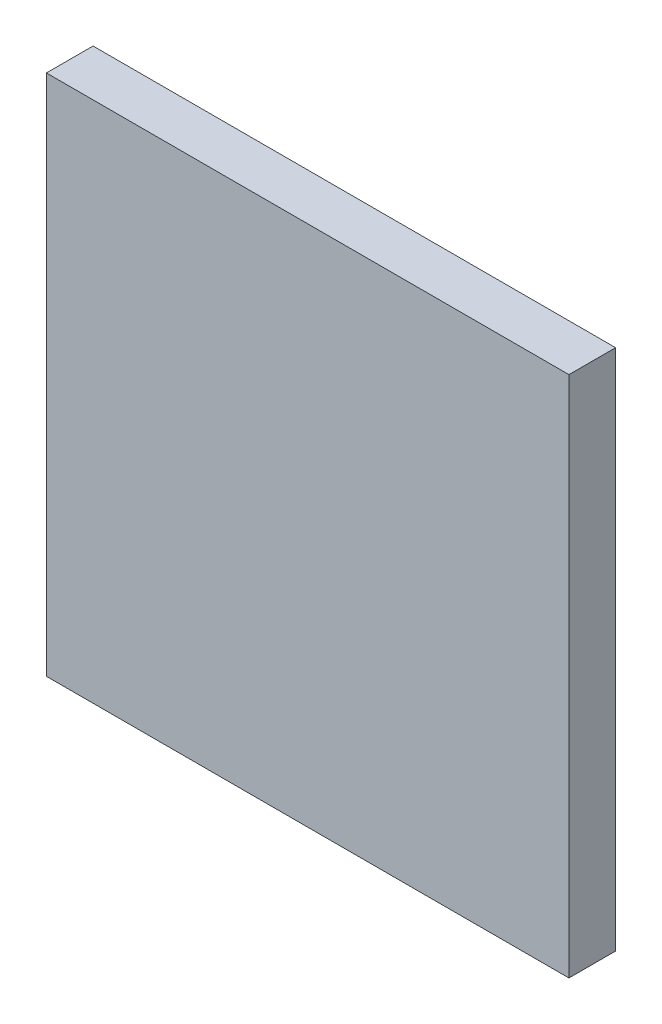
ISO-10303-21;
HEADER;
FILE_DESCRIPTION(('STEP AP214'),'2;1');
FILE_NAME('part.step','',(''),(''),'','','');
FILE_SCHEMA(('AUTOMOTIVE_DESIGN { 1 0 10303 214 1 1 1 1 }'));
ENDSEC;
DATA;
#1=APPLICATION_CONTEXT('core data for automotive mechanical design processes');
#2=APPLICATION_PROTOCOL_DEFINITION('international standard','automotive_design',2000,#1);
#3=PRODUCT_CONTEXT('',#1,'mechanical');
#4=PRODUCT('Part','Part','',(#3));
#5=PRODUCT_RELATED_PRODUCT_CATEGORY('part','',(#4));
#6=PRODUCT_DEFINITION_FORMATION('','',#4);
#7=PRODUCT_DEFINITION_CONTEXT('part definition',#1,'design');
#8=PRODUCT_DEFINITION('design','',#6,#7);
#9=PRODUCT_DEFINITION_SHAPE('','',#8);
#10=(LENGTH_UNIT() NAMED_UNIT(*) SI_UNIT(.MILLI.,.METRE.));
#11=(NAMED_UNIT(*) PLANE_ANGLE_UNIT() SI_UNIT($,.RADIAN.));
#12=(NAMED_UNIT(*) SI_UNIT($,.STERADIAN.) SOLID_ANGLE_UNIT());
#13=UNCERTAINTY_MEASURE_WITH_UNIT(LENGTH_MEASURE(1.E-05),#10,'distance_accuracy_value','');
#14=(GEOMETRIC_REPRESENTATION_CONTEXT(3) GLOBAL_UNCERTAINTY_ASSIGNED_CONTEXT((#13)) GLOBAL_UNIT_ASSIGNED_CONTEXT((#10,
#11,#12)) REPRESENTATION_CONTEXT('',''));
#15=CARTESIAN_POINT('',(0.,0.,0.));
#16=DIRECTION('',(0.,0.,1.));
#17=DIRECTION('',(1.,0.,0.));
#18=AXIS2_PLACEMENT_3D('',#15,#16,#17);
#19=CARTESIAN_POINT('',(28.,28.,2.));
#20=DIRECTION('',(0.,-1.,0.));
#21=DIRECTION('',(0.,0.,-1.));
#22=AXIS2_PLACEMENT_3D('',#19,#20,#21);
#23=PLANE('',#22);
#24=DIRECTION('',(0.,0.,-1.));
#25=VECTOR('',#24,1.);
#26=CARTESIAN_POINT('',(28.,28.,2.));
#27=LINE('',#26,#25);
#28=CARTESIAN_POINT('',(28.,28.,2.));
#29=VERTEX_POINT('',#28);
#30=CARTESIAN_POINT('',(28.,28.,-3.));
#31=VERTEX_POINT('',#30);
#32=EDGE_CURVE('E154',#29,#31,#27,.T.);
#33=ORIENTED_EDGE('',*,*,#32,.T.);
#34=DIRECTION('',(-1.,0.,0.));
#35=VECTOR('',#34,1.);
#36=CARTESIAN_POINT('',(0.,28.,-3.));
#37=LINE('',#36,#35);
#38=CARTESIAN_POINT('',(-28.,28.,-3.));
#39=VERTEX_POINT('',#38);
#40=EDGE_CURVE('E128',#31,#39,#37,.T.);
#41=ORIENTED_EDGE('',*,*,#40,.T.);
#42=DIRECTION('',(0.,0.,-1.));
#43=VECTOR('',#42,1.);
#44=CARTESIAN_POINT('',(-28.,28.,2.));
#45=LINE('',#44,#43);
#46=CARTESIAN_POINT('',(-28.,28.,2.));
#47=VERTEX_POINT('',#46);
#48=EDGE_CURVE('E11',#47,#39,#45,.T.);
#49=ORIENTED_EDGE('',*,*,#48,.F.);
#50=DIRECTION('',(-1.,0.,0.));
#51=VECTOR('',#50,1.);
#52=CARTESIAN_POINT('',(28.,28.,2.));
#53=LINE('',#52,#51);
#54=EDGE_CURVE('E141',#29,#47,#53,.T.);
#55=ORIENTED_EDGE('',*,*,#54,.F.);
#56=EDGE_LOOP('',(#33,#41,#49,#55));
#57=FACE_BOUND('',#56,.T.);
#58=ADVANCED_FACE('F33',(#57),#23,.F.);
#59=CARTESIAN_POINT('',(-28.,28.,2.));
#60=DIRECTION('',(1.,0.,0.));
#61=DIRECTION('',(0.,1.,0.));
#62=AXIS2_PLACEMENT_3D('',#59,#60,#61);
#63=PLANE('',#62);
#64=ORIENTED_EDGE('',*,*,#48,.T.);
#65=DIRECTION('',(0.,-1.,0.));
#66=VECTOR('',#65,1.);
#67=CARTESIAN_POINT('',(-28.,0.,-3.));
#68=LINE('',#67,#66);
#69=CARTESIAN_POINT('',(-28.,-28.,-3.));
#70=VERTEX_POINT('',#69);
#71=EDGE_CURVE('E131',#39,#70,#68,.T.);
#72=ORIENTED_EDGE('',*,*,#71,.T.);
#73=DIRECTION('',(0.,0.,-1.));
#74=VECTOR('',#73,1.);
#75=CARTESIAN_POINT('',(-28.,-28.,2.));
#76=LINE('',#75,#74);
#77=CARTESIAN_POINT('',(-28.,-28.,2.));
#78=VERTEX_POINT('',#77);
#79=EDGE_CURVE('E40',#78,#70,#76,.T.);
#80=ORIENTED_EDGE('',*,*,#79,.F.);
#81=DIRECTION('',(0.,-1.,0.));
#82=VECTOR('',#81,1.);
#83=CARTESIAN_POINT('',(-28.,28.,2.));
#84=LINE('',#83,#82);
#85=EDGE_CURVE('E148',#47,#78,#84,.T.);
#86=ORIENTED_EDGE('',*,*,#85,.F.);
#87=EDGE_LOOP('',(#64,#72,#80,#86));
#88=FACE_BOUND('',#87,.T.);
#89=ADVANCED_FACE('F165',(#88),#63,.F.);
#90=CARTESIAN_POINT('',(-28.,-28.,2.));
#91=DIRECTION('',(0.,1.,0.));
#92=DIRECTION('',(0.,0.,1.));
#93=AXIS2_PLACEMENT_3D('',#90,#91,#92);
#94=PLANE('',#93);
#95=ORIENTED_EDGE('',*,*,#79,.T.);
#96=DIRECTION('',(1.,0.,0.));
#97=VECTOR('',#96,1.);
#98=CARTESIAN_POINT('',(0.,-28.,-3.));
#99=LINE('',#98,#97);
#100=CARTESIAN_POINT('',(28.,-28.,-3.));
#101=VERTEX_POINT('',#100);
#102=EDGE_CURVE('E115',#70,#101,#99,.T.);
#103=ORIENTED_EDGE('',*,*,#102,.T.);
#104=DIRECTION('',(0.,0.,-1.));
#105=VECTOR('',#104,1.);
#106=CARTESIAN_POINT('',(28.,-28.,2.));
#107=LINE('',#106,#105);
#108=CARTESIAN_POINT('',(28.,-28.,2.));
#109=VERTEX_POINT('',#108);
#110=EDGE_CURVE('E156',#109,#101,#107,.T.);
#111=ORIENTED_EDGE('',*,*,#110,.F.);
#112=DIRECTION('',(1.,0.,0.));
#113=VECTOR('',#112,1.);
#114=CARTESIAN_POINT('',(-28.,-28.,2.));
#115=LINE('',#114,#113);
#116=EDGE_CURVE('E150',#78,#109,#115,.T.);
#117=ORIENTED_EDGE('',*,*,#116,.F.);
#118=EDGE_LOOP('',(#95,#103,#111,#117));
#119=FACE_BOUND('',#118,.T.);
#120=ADVANCED_FACE('F160',(#119),#94,.F.);
#121=CARTESIAN_POINT('',(28.,-28.,2.));
#122=DIRECTION('',(-1.,0.,0.));
#123=DIRECTION('',(0.,-1.,0.));
#124=AXIS2_PLACEMENT_3D('',#121,#122,#123);
#125=PLANE('',#124);
#126=ORIENTED_EDGE('',*,*,#110,.T.);
#127=DIRECTION('',(0.,1.,0.));
#128=VECTOR('',#127,1.);
#129=CARTESIAN_POINT('',(28.,0.,-3.));
#130=LINE('',#129,#128);
#131=EDGE_CURVE('E125',#101,#31,#130,.T.);
#132=ORIENTED_EDGE('',*,*,#131,.T.);
#133=ORIENTED_EDGE('',*,*,#32,.F.);
#134=DIRECTION('',(0.,1.,0.));
#135=VECTOR('',#134,1.);
#136=CARTESIAN_POINT('',(28.,-28.,2.));
#137=LINE('',#136,#135);
#138=EDGE_CURVE('E152',#109,#29,#137,.T.);
#139=ORIENTED_EDGE('',*,*,#138,.F.);
#140=EDGE_LOOP('',(#126,#132,#133,#139));
#141=FACE_BOUND('',#140,.T.);
#142=ADVANCED_FACE('F171',(#141),#125,.F.);
#143=CARTESIAN_POINT('',(0.,0.,2.));
#144=DIRECTION('',(0.,0.,1.));
#145=DIRECTION('',(1.,0.,0.));
#146=AXIS2_PLACEMENT_3D('',#143,#144,#145);
#147=PLANE('',#146);
#148=ORIENTED_EDGE('',*,*,#54,.T.);
#149=ORIENTED_EDGE('',*,*,#85,.T.);
#150=ORIENTED_EDGE('',*,*,#116,.T.);
#151=ORIENTED_EDGE('',*,*,#138,.T.);
#152=EDGE_LOOP('',(#148,#149,#150,#151));
#153=FACE_BOUND('',#152,.T.);
#154=ADVANCED_FACE('F175',(#153),#147,.T.);
#155=CARTESIAN_POINT('',(-26.5,0.,-3.));
#156=DIRECTION('',(-1.,0.,0.));
#157=DIRECTION('',(0.,-1.,0.));
#158=AXIS2_PLACEMENT_3D('',#155,#156,#157);
#159=PLANE('',#158);
#160=DIRECTION('',(0.,-1.,0.));
#161=VECTOR('',#160,1.);
#162=CARTESIAN_POINT('',(-26.5,0.,0.));
#163=LINE('',#162,#161);
#164=CARTESIAN_POINT('',(-26.5,26.5,0.));
#165=VERTEX_POINT('',#164);
#166=CARTESIAN_POINT('',(-26.5,-26.5,0.));
#167=VERTEX_POINT('',#166);
#168=EDGE_CURVE('E136',#165,#167,#163,.T.);
#169=ORIENTED_EDGE('',*,*,#168,.T.);
#170=DIRECTION('',(0.,0.,1.));
#171=VECTOR('',#170,1.);
#172=CARTESIAN_POINT('',(-26.5,-26.5,-3.));
#173=LINE('',#172,#171);
#174=CARTESIAN_POINT('',(-26.5,-26.5,-3.));
#175=VERTEX_POINT('',#174);
#176=EDGE_CURVE('E118',#175,#167,#173,.T.);
#177=ORIENTED_EDGE('',*,*,#176,.F.);
#178=DIRECTION('',(0.,-1.,0.));
#179=VECTOR('',#178,1.);
#180=CARTESIAN_POINT('',(-26.5,0.,-3.));
#181=LINE('',#180,#179);
#182=CARTESIAN_POINT('',(-26.5,26.5,-3.));
#183=VERTEX_POINT('',#182);
#184=EDGE_CURVE('E99',#183,#175,#181,.T.);
#185=ORIENTED_EDGE('',*,*,#184,.F.);
#186=DIRECTION('',(0.,0.,1.));
#187=VECTOR('',#186,1.);
#188=CARTESIAN_POINT('',(-26.5,26.5,-3.));
#189=LINE('',#188,#187);
#190=EDGE_CURVE('E109',#183,#165,#189,.T.);
#191=ORIENTED_EDGE('',*,*,#190,.T.);
#192=EDGE_LOOP('',(#169,#177,#185,#191));
#193=FACE_BOUND('',#192,.T.);
#194=ADVANCED_FACE('F117',(#193),#159,.F.);
#195=CARTESIAN_POINT('',(0.,-26.5,-3.));
#196=DIRECTION('',(0.,-1.,0.));
#197=DIRECTION('',(0.,0.,-1.));
#198=AXIS2_PLACEMENT_3D('',#195,#196,#197);
#199=PLANE('',#198);
#200=DIRECTION('',(1.,0.,0.));
#201=VECTOR('',#200,1.);
#202=CARTESIAN_POINT('',(0.,-26.5,0.));
#203=LINE('',#202,#201);
#204=CARTESIAN_POINT('',(26.5,-26.5,0.));
#205=VERTEX_POINT('',#204);
#206=EDGE_CURVE('E47',#167,#205,#203,.T.);
#207=ORIENTED_EDGE('',*,*,#206,.T.);
#208=DIRECTION('',(0.,0.,1.));
#209=VECTOR('',#208,1.);
#210=CARTESIAN_POINT('',(26.5,-26.5,-3.));
#211=LINE('',#210,#209);
#212=CARTESIAN_POINT('',(26.5,-26.5,-3.));
#213=VERTEX_POINT('',#212);
#214=EDGE_CURVE('E142',#213,#205,#211,.T.);
#215=ORIENTED_EDGE('',*,*,#214,.F.);
#216=DIRECTION('',(1.,0.,0.));
#217=VECTOR('',#216,1.);
#218=CARTESIAN_POINT('',(0.,-26.5,-3.));
#219=LINE('',#218,#217);
#220=EDGE_CURVE('E123',#175,#213,#219,.T.);
#221=ORIENTED_EDGE('',*,*,#220,.F.);
#222=ORIENTED_EDGE('',*,*,#176,.T.);
#223=EDGE_LOOP('',(#207,#215,#221,#222));
#224=FACE_BOUND('',#223,.T.);
#225=ADVANCED_FACE('F195',(#224),#199,.F.);
#226=CARTESIAN_POINT('',(26.5,0.,-3.));
#227=DIRECTION('',(1.,0.,0.));
#228=DIRECTION('',(0.,1.,0.));
#229=AXIS2_PLACEMENT_3D('',#226,#227,#228);
#230=PLANE('',#229);
#231=DIRECTION('',(0.,1.,0.));
#232=VECTOR('',#231,1.);
#233=CARTESIAN_POINT('',(26.5,0.,0.));
#234=LINE('',#233,#232);
#235=CARTESIAN_POINT('',(26.5,26.5,0.));
#236=VERTEX_POINT('',#235);
#237=EDGE_CURVE('E52',#205,#236,#234,.T.);
#238=ORIENTED_EDGE('',*,*,#237,.T.);
#239=DIRECTION('',(0.,0.,1.));
#240=VECTOR('',#239,1.);
#241=CARTESIAN_POINT('',(26.5,26.5,-3.));
#242=LINE('',#241,#240);
#243=CARTESIAN_POINT('',(26.5,26.5,-3.));
#244=VERTEX_POINT('',#243);
#245=EDGE_CURVE('E114',#244,#236,#242,.T.);
#246=ORIENTED_EDGE('',*,*,#245,.F.);
#247=DIRECTION('',(0.,1.,0.));
#248=VECTOR('',#247,1.);
#249=CARTESIAN_POINT('',(26.5,0.,-3.));
#250=LINE('',#249,#248);
#251=EDGE_CURVE('E102',#213,#244,#250,.T.);
#252=ORIENTED_EDGE('',*,*,#251,.F.);
#253=ORIENTED_EDGE('',*,*,#214,.T.);
#254=EDGE_LOOP('',(#238,#246,#252,#253));
#255=FACE_BOUND('',#254,.T.);
#256=ADVANCED_FACE('F198',(#255),#230,.F.);
#257=CARTESIAN_POINT('',(0.,26.5,-3.));
#258=DIRECTION('',(0.,1.,0.));
#259=DIRECTION('',(0.,0.,1.));
#260=AXIS2_PLACEMENT_3D('',#257,#258,#259);
#261=PLANE('',#260);
#262=DIRECTION('',(-1.,0.,0.));
#263=VECTOR('',#262,1.);
#264=CARTESIAN_POINT('',(0.,26.5,0.));
#265=LINE('',#264,#263);
#266=EDGE_CURVE('E111',#236,#165,#265,.T.);
#267=ORIENTED_EDGE('',*,*,#266,.T.);
#268=ORIENTED_EDGE('',*,*,#190,.F.);
#269=DIRECTION('',(-1.,0.,0.));
#270=VECTOR('',#269,1.);
#271=CARTESIAN_POINT('',(0.,26.5,-3.));
#272=LINE('',#271,#270);
#273=EDGE_CURVE('E94',#244,#183,#272,.T.);
#274=ORIENTED_EDGE('',*,*,#273,.F.);
#275=ORIENTED_EDGE('',*,*,#245,.T.);
#276=EDGE_LOOP('',(#267,#268,#274,#275));
#277=FACE_BOUND('',#276,.T.);
#278=ADVANCED_FACE('F110',(#277),#261,.F.);
#279=CARTESIAN_POINT('',(0.,0.,-3.));
#280=DIRECTION('',(0.,0.,1.));
#281=DIRECTION('',(1.,0.,0.));
#282=AXIS2_PLACEMENT_3D('',#279,#280,#281);
#283=PLANE('',#282);
#284=ORIENTED_EDGE('',*,*,#184,.T.);
#285=ORIENTED_EDGE('',*,*,#220,.T.);
#286=ORIENTED_EDGE('',*,*,#251,.T.);
#287=ORIENTED_EDGE('',*,*,#273,.T.);
#288=EDGE_LOOP('',(#284,#285,#286,#287));
#289=FACE_BOUND('',#288,.T.);
#290=ORIENTED_EDGE('',*,*,#131,.F.);
#291=ORIENTED_EDGE('',*,*,#102,.F.);
#292=ORIENTED_EDGE('',*,*,#71,.F.);
#293=ORIENTED_EDGE('',*,*,#40,.F.);
#294=EDGE_LOOP('',(#290,#291,#292,#293));
#295=FACE_BOUND('',#294,.T.);
#296=ADVANCED_FACE('F96',(#289,#295),#283,.F.);
#297=CARTESIAN_POINT('',(0.,0.,0.));
#298=DIRECTION('',(0.,0.,1.));
#299=DIRECTION('',(1.,0.,0.));
#300=AXIS2_PLACEMENT_3D('',#297,#298,#299);
#301=PLANE('',#300);
#302=ORIENTED_EDGE('',*,*,#168,.F.);
#303=ORIENTED_EDGE('',*,*,#266,.F.);
#304=ORIENTED_EDGE('',*,*,#237,.F.);
#305=ORIENTED_EDGE('',*,*,#206,.F.);
#306=EDGE_LOOP('',(#302,#303,#304,#305));
#307=FACE_BOUND('',#306,.T.);
#308=ADVANCED_FACE('F188',(#307),#301,.F.);
#309=CLOSED_SHELL('',(#58,#89,#120,#142,#154,#194,#225,#256,#278,#296,#308));
#310=MANIFOLD_SOLID_BREP('B2',#309);
#311=ADVANCED_BREP_SHAPE_REPRESENTATION('',(#18,#310),#14);
#312=SHAPE_DEFINITION_REPRESENTATION(#9,#311);
ENDSEC;
END-ISO-10303-21;
